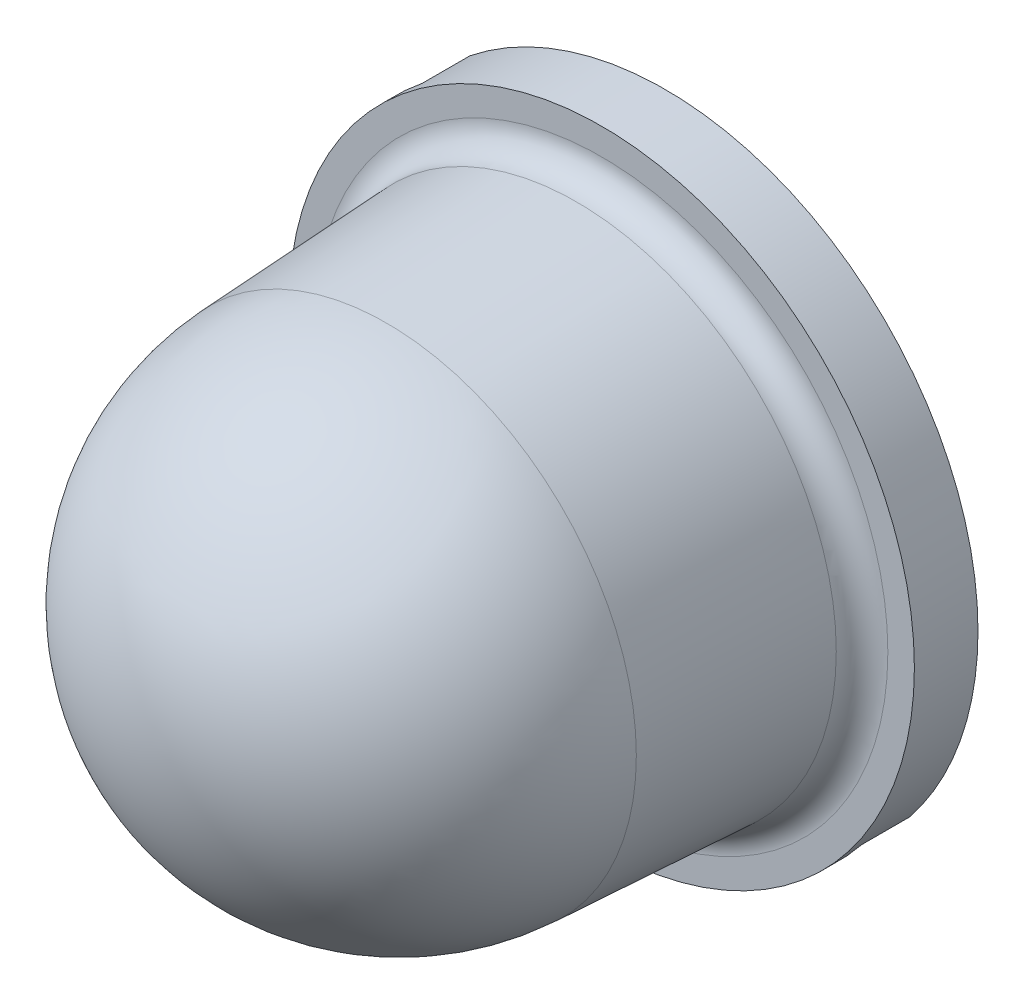
ISO-10303-21;
HEADER;
FILE_DESCRIPTION(('STEP AP214'),'2;1');
FILE_NAME('part.step','',(''),(''),'','','');
FILE_SCHEMA(('AUTOMOTIVE_DESIGN { 1 0 10303 214 1 1 1 1 }'));
ENDSEC;
DATA;
#1=APPLICATION_CONTEXT('core data for automotive mechanical design processes');
#2=APPLICATION_PROTOCOL_DEFINITION('international standard','automotive_design',2000,#1);
#3=PRODUCT_CONTEXT('',#1,'mechanical');
#4=PRODUCT('Part','Part','',(#3));
#5=PRODUCT_RELATED_PRODUCT_CATEGORY('part','',(#4));
#6=PRODUCT_DEFINITION_FORMATION('','',#4);
#7=PRODUCT_DEFINITION_CONTEXT('part definition',#1,'design');
#8=PRODUCT_DEFINITION('design','',#6,#7);
#9=PRODUCT_DEFINITION_SHAPE('','',#8);
#10=(LENGTH_UNIT() NAMED_UNIT(*) SI_UNIT(.MILLI.,.METRE.));
#11=(NAMED_UNIT(*) PLANE_ANGLE_UNIT() SI_UNIT($,.RADIAN.));
#12=(NAMED_UNIT(*) SI_UNIT($,.STERADIAN.) SOLID_ANGLE_UNIT());
#13=UNCERTAINTY_MEASURE_WITH_UNIT(LENGTH_MEASURE(1.E-05),#10,'distance_accuracy_value','');
#14=(GEOMETRIC_REPRESENTATION_CONTEXT(3) GLOBAL_UNCERTAINTY_ASSIGNED_CONTEXT((#13)) GLOBAL_UNIT_ASSIGNED_CONTEXT((#10,
#11,#12)) REPRESENTATION_CONTEXT('',''));
#15=CARTESIAN_POINT('',(0.,0.,0.));
#16=DIRECTION('',(0.,0.,1.));
#17=DIRECTION('',(1.,0.,0.));
#18=AXIS2_PLACEMENT_3D('',#15,#16,#17);
#19=CARTESIAN_POINT('',(0.,0.,9.11138954414596));
#20=DIRECTION('',(0.,0.,1.));
#21=DIRECTION('',(1.,0.,0.));
#22=AXIS2_PLACEMENT_3D('',#19,#20,#21);
#23=CYLINDRICAL_SURFACE('',#22,4.8);
#24=CARTESIAN_POINT('',(0.,0.,0.699999999999999));
#25=DIRECTION('',(0.,0.,1.));
#26=DIRECTION('',(1.,0.,0.));
#27=AXIS2_PLACEMENT_3D('',#24,#25,#26);
#28=CIRCLE('',#27,4.8);
#29=CARTESIAN_POINT('',(-3.8224679027231,2.90322908718063,0.7));
#30=VERTEX_POINT('',#29);
#31=CARTESIAN_POINT('',(2.90322908718058,-3.82246790272313,0.699999999999999));
#32=VERTEX_POINT('',#31);
#33=EDGE_CURVE('E174',#30,#32,#28,.T.);
#34=ORIENTED_EDGE('',*,*,#33,.T.);
#35=DIRECTION('',(0.,0.,-1.));
#36=VECTOR('',#35,1.);
#37=CARTESIAN_POINT('',(2.90322908718058,-3.82246790272313,0.9));
#38=LINE('',#37,#36);
#39=CARTESIAN_POINT('',(2.90322908718058,-3.82246790272313,0.));
#40=VERTEX_POINT('',#39);
#41=EDGE_CURVE('E121',#32,#40,#38,.T.);
#42=ORIENTED_EDGE('',*,*,#41,.T.);
#43=CARTESIAN_POINT('',(0.,0.,0.));
#44=DIRECTION('',(0.,0.,1.));
#45=DIRECTION('',(1.,0.,0.));
#46=AXIS2_PLACEMENT_3D('',#43,#44,#45);
#47=CIRCLE('',#46,4.8);
#48=CARTESIAN_POINT('',(-3.8224679027231,2.90322908718063,0.));
#49=VERTEX_POINT('',#48);
#50=EDGE_CURVE('E198',#49,#40,#47,.T.);
#51=ORIENTED_EDGE('',*,*,#50,.F.);
#52=DIRECTION('',(0.,0.,-1.));
#53=VECTOR('',#52,1.);
#54=CARTESIAN_POINT('',(-3.8224679027231,2.90322908718063,0.9));
#55=LINE('',#54,#53);
#56=EDGE_CURVE('E152',#30,#49,#55,.T.);
#57=ORIENTED_EDGE('',*,*,#56,.F.);
#58=EDGE_LOOP('',(#34,#42,#51,#57));
#59=FACE_BOUND('',#58,.T.);
#60=ADVANCED_FACE('F35',(#59),#23,.F.);
#61=CARTESIAN_POINT('',(-5.9,0.,0.));
#62=DIRECTION('',(0.,0.,1.));
#63=DIRECTION('',(1.,0.,0.));
#64=AXIS2_PLACEMENT_3D('',#61,#62,#63);
#65=PLANE('',#64);
#66=ORIENTED_EDGE('',*,*,#50,.T.);
#67=DIRECTION('',(-0.707106781186543,0.707106781186551,0.));
#68=VECTOR('',#67,1.);
#69=CARTESIAN_POINT('',(3.71231060122935,-4.63154941677191,0.));
#70=LINE('',#69,#68);
#71=CARTESIAN_POINT('',(3.68691529002156,-4.60615410556412,0.));
#72=VERTEX_POINT('',#71);
#73=EDGE_CURVE('E134',#72,#40,#70,.T.);
#74=ORIENTED_EDGE('',*,*,#73,.F.);
#75=CARTESIAN_POINT('',(0.,0.,0.));
#76=DIRECTION('',(0.,0.,1.));
#77=DIRECTION('',(1.,0.,0.));
#78=AXIS2_PLACEMENT_3D('',#75,#76,#77);
#79=CIRCLE('',#78,5.9);
#80=CARTESIAN_POINT('',(-4.60615410556408,3.68691529002162,0.));
#81=VERTEX_POINT('',#80);
#82=EDGE_CURVE('E195',#81,#72,#79,.T.);
#83=ORIENTED_EDGE('',*,*,#82,.F.);
#84=DIRECTION('',(-0.707106781186543,0.707106781186551,0.));
#85=VECTOR('',#84,1.);
#86=CARTESIAN_POINT('',(-4.63154941677187,3.7123106012294,0.));
#87=LINE('',#86,#85);
#88=EDGE_CURVE('E153',#49,#81,#87,.T.);
#89=ORIENTED_EDGE('',*,*,#88,.F.);
#90=EDGE_LOOP('',(#66,#74,#83,#89));
#91=FACE_BOUND('',#90,.T.);
#92=ADVANCED_FACE('F206',(#91),#65,.F.);
#93=CARTESIAN_POINT('',(3.8224679027231,-2.90322908718063,0.));
#94=VERTEX_POINT('',#93);
#95=CARTESIAN_POINT('',(-2.90322908718059,3.82246790272313,0.));
#96=VERTEX_POINT('',#95);
#97=EDGE_CURVE('E196',#94,#96,#47,.T.);
#98=ORIENTED_EDGE('',*,*,#97,.F.);
#99=DIRECTION('',(0.,0.,-1.));
#100=VECTOR('',#99,1.);
#101=CARTESIAN_POINT('',(3.8224679027231,-2.90322908718063,0.9));
#102=LINE('',#101,#100);
#103=CARTESIAN_POINT('',(3.8224679027231,-2.90322908718063,0.7));
#104=VERTEX_POINT('',#103);
#105=EDGE_CURVE('E122',#104,#94,#102,.T.);
#106=ORIENTED_EDGE('',*,*,#105,.F.);
#107=CARTESIAN_POINT('',(-2.90322908718059,3.82246790272313,0.699999999999999));
#108=VERTEX_POINT('',#107);
#109=EDGE_CURVE('E170',#104,#108,#28,.T.);
#110=ORIENTED_EDGE('',*,*,#109,.T.);
#111=DIRECTION('',(0.,0.,-1.));
#112=VECTOR('',#111,1.);
#113=CARTESIAN_POINT('',(-2.90322908718059,3.82246790272313,0.9));
#114=LINE('',#113,#112);
#115=EDGE_CURVE('E157',#108,#96,#114,.T.);
#116=ORIENTED_EDGE('',*,*,#115,.T.);
#117=EDGE_LOOP('',(#98,#106,#110,#116));
#118=FACE_BOUND('',#117,.T.);
#119=ADVANCED_FACE('F37',(#118),#23,.F.);
#120=CARTESIAN_POINT('',(4.60615410556408,-3.68691529002162,0.));
#121=VERTEX_POINT('',#120);
#122=CARTESIAN_POINT('',(-3.68691529002157,4.60615410556412,0.));
#123=VERTEX_POINT('',#122);
#124=EDGE_CURVE('E192',#121,#123,#79,.T.);
#125=ORIENTED_EDGE('',*,*,#124,.F.);
#126=DIRECTION('',(0.707106781186544,-0.707106781186552,0.));
#127=VECTOR('',#126,1.);
#128=CARTESIAN_POINT('',(3.8224679027231,-2.90322908718063,0.));
#129=LINE('',#128,#127);
#130=EDGE_CURVE('E136',#94,#121,#129,.T.);
#131=ORIENTED_EDGE('',*,*,#130,.F.);
#132=ORIENTED_EDGE('',*,*,#97,.T.);
#133=DIRECTION('',(0.707106781186543,-0.707106781186552,0.));
#134=VECTOR('',#133,1.);
#135=CARTESIAN_POINT('',(-2.90322908718059,3.82246790272313,0.));
#136=LINE('',#135,#134);
#137=EDGE_CURVE('E147',#123,#96,#136,.T.);
#138=ORIENTED_EDGE('',*,*,#137,.F.);
#139=EDGE_LOOP('',(#125,#131,#132,#138));
#140=FACE_BOUND('',#139,.T.);
#141=ADVANCED_FACE('F237',(#140),#65,.F.);
#142=CARTESIAN_POINT('',(0.,0.,9.11138954414596));
#143=DIRECTION('',(0.,0.,1.));
#144=DIRECTION('',(1.,0.,0.));
#145=AXIS2_PLACEMENT_3D('',#142,#143,#144);
#146=CYLINDRICAL_SURFACE('',#145,5.9);
#147=ORIENTED_EDGE('',*,*,#82,.T.);
#148=DIRECTION('',(0.,0.,1.));
#149=VECTOR('',#148,1.);
#150=CARTESIAN_POINT('',(3.68691529002156,-4.60615410556412,9.11138954414596));
#151=LINE('',#150,#149);
#152=CARTESIAN_POINT('',(3.68691529002156,-4.60615410556412,0.9));
#153=VERTEX_POINT('',#152);
#154=EDGE_CURVE('E167',#72,#153,#151,.T.);
#155=ORIENTED_EDGE('',*,*,#154,.T.);
#156=CARTESIAN_POINT('',(0.,0.,0.9));
#157=DIRECTION('',(0.,0.,1.));
#158=DIRECTION('',(1.,0.,0.));
#159=AXIS2_PLACEMENT_3D('',#156,#157,#158);
#160=CIRCLE('',#159,5.9);
#161=CARTESIAN_POINT('',(4.60615410556408,-3.68691529002162,0.9));
#162=VERTEX_POINT('',#161);
#163=EDGE_CURVE('E11',#153,#162,#160,.T.);
#164=ORIENTED_EDGE('',*,*,#163,.T.);
#165=DIRECTION('',(0.,0.,1.));
#166=VECTOR('',#165,1.);
#167=CARTESIAN_POINT('',(4.60615410556408,-3.68691529002162,9.11138954414596));
#168=LINE('',#167,#166);
#169=EDGE_CURVE('E128',#162,#121,#168,.F.);
#170=ORIENTED_EDGE('',*,*,#169,.T.);
#171=ORIENTED_EDGE('',*,*,#124,.T.);
#172=DIRECTION('',(0.,0.,1.));
#173=VECTOR('',#172,1.);
#174=CARTESIAN_POINT('',(-3.68691529002157,4.60615410556412,9.11138954414596));
#175=LINE('',#174,#173);
#176=CARTESIAN_POINT('',(-3.68691529002157,4.60615410556412,0.9));
#177=VERTEX_POINT('',#176);
#178=EDGE_CURVE('E163',#123,#177,#175,.T.);
#179=ORIENTED_EDGE('',*,*,#178,.T.);
#180=CARTESIAN_POINT('',(0.,0.,0.9));
#181=DIRECTION('',(0.,0.,1.));
#182=DIRECTION('',(1.,0.,0.));
#183=AXIS2_PLACEMENT_3D('',#180,#181,#182);
#184=CIRCLE('',#183,5.9);
#185=CARTESIAN_POINT('',(-4.60615410556408,3.68691529002162,0.9));
#186=VERTEX_POINT('',#185);
#187=EDGE_CURVE('E43',#177,#186,#184,.T.);
#188=ORIENTED_EDGE('',*,*,#187,.T.);
#189=DIRECTION('',(0.,0.,1.));
#190=VECTOR('',#189,1.);
#191=CARTESIAN_POINT('',(-4.60615410556408,3.68691529002162,9.11138954414596));
#192=LINE('',#191,#190);
#193=EDGE_CURVE('E141',#186,#81,#192,.F.);
#194=ORIENTED_EDGE('',*,*,#193,.T.);
#195=EDGE_LOOP('',(#147,#155,#164,#170,#171,#179,#188,#194));
#196=FACE_BOUND('',#195,.T.);
#197=CARTESIAN_POINT('',(0.,0.,1.2));
#198=DIRECTION('',(0.,0.,1.));
#199=DIRECTION('',(1.,0.,0.));
#200=AXIS2_PLACEMENT_3D('',#197,#198,#199);
#201=CIRCLE('',#200,5.9);
#202=CARTESIAN_POINT('',(5.9,0.,1.2));
#203=VERTEX_POINT('',#202);
#204=EDGE_CURVE('E189',#203,#203,#201,.T.);
#205=ORIENTED_EDGE('',*,*,#204,.F.);
#206=EDGE_LOOP('',(#205));
#207=FACE_BOUND('',#206,.T.);
#208=ADVANCED_FACE('F239',(#196,#207),#146,.T.);
#209=CARTESIAN_POINT('',(-5.9,0.,1.2));
#210=DIRECTION('',(0.,0.,-1.));
#211=DIRECTION('',(-1.,0.,0.));
#212=AXIS2_PLACEMENT_3D('',#209,#210,#211);
#213=PLANE('',#212);
#214=CARTESIAN_POINT('',(0.,0.,1.2));
#215=DIRECTION('',(0.,0.,1.));
#216=DIRECTION('',(1.,0.,0.));
#217=AXIS2_PLACEMENT_3D('',#214,#215,#216);
#218=CIRCLE('',#217,5.39931476737729);
#219=CARTESIAN_POINT('',(5.39931476737729,0.,1.2));
#220=VERTEX_POINT('',#219);
#221=EDGE_CURVE('E186',#220,#220,#218,.T.);
#222=ORIENTED_EDGE('',*,*,#221,.F.);
#223=EDGE_LOOP('',(#222));
#224=FACE_BOUND('',#223,.T.);
#225=ORIENTED_EDGE('',*,*,#204,.T.);
#226=EDGE_LOOP('',(#225));
#227=FACE_BOUND('',#226,.T.);
#228=ADVANCED_FACE('F242',(#224,#227),#213,.F.);
#229=CARTESIAN_POINT('',(0.,0.,1.7));
#230=DIRECTION('',(0.,0.,1.));
#231=DIRECTION('',(1.,0.,0.));
#232=AXIS2_PLACEMENT_3D('',#229,#230,#231);
#233=TOROIDAL_SURFACE('',#232,5.39931476737729,0.5);
#234=CARTESIAN_POINT('',(0.,0.,1.67383202187853));
#235=DIRECTION('',(0.,0.,1.));
#236=DIRECTION('',(1.,0.,0.));
#237=AXIS2_PLACEMENT_3D('',#234,#235,#236);
#238=CIRCLE('',#237,4.9);
#239=CARTESIAN_POINT('',(4.9,0.,1.67383202187853));
#240=VERTEX_POINT('',#239);
#241=EDGE_CURVE('E183',#240,#240,#238,.T.);
#242=ORIENTED_EDGE('',*,*,#241,.F.);
#243=EDGE_LOOP('',(#242));
#244=FACE_BOUND('',#243,.T.);
#245=ORIENTED_EDGE('',*,*,#221,.T.);
#246=EDGE_LOOP('',(#245));
#247=FACE_BOUND('',#246,.T.);
#248=ADVANCED_FACE('F247',(#244,#247),#233,.F.);
#249=CARTESIAN_POINT('',(0.,0.,1.67383202187853));
#250=DIRECTION('',(0.,0.,-1.));
#251=DIRECTION('',(-1.,0.,0.));
#252=AXIS2_PLACEMENT_3D('',#249,#250,#251);
#253=CONICAL_SURFACE('',#252,4.9,0.05235987755983);
#254=CARTESIAN_POINT('',(0.,0.,5.25834253449101));
#255=DIRECTION('',(0.,0.,1.));
#256=DIRECTION('',(1.,0.,0.));
#257=AXIS2_PLACEMENT_3D('',#254,#255,#256);
#258=CIRCLE('',#257,4.71214376421726);
#259=CARTESIAN_POINT('',(4.71214376421726,0.,5.25834253449101));
#260=VERTEX_POINT('',#259);
#261=EDGE_CURVE('E180',#260,#260,#258,.T.);
#262=ORIENTED_EDGE('',*,*,#261,.F.);
#263=EDGE_LOOP('',(#262));
#264=FACE_BOUND('',#263,.T.);
#265=ORIENTED_EDGE('',*,*,#241,.T.);
#266=EDGE_LOOP('',(#265));
#267=FACE_BOUND('',#266,.T.);
#268=ADVANCED_FACE('F253',(#264,#267),#253,.T.);
#269=CARTESIAN_POINT('',(0.,0.,5.01138954414596));
#270=DIRECTION('',(0.,0.,1.));
#271=DIRECTION('',(-1.,0.,0.));
#272=AXIS2_PLACEMENT_3D('',#269,#270,#271);
#273=SPHERICAL_SURFACE('',#272,4.71861045585388);
#274=ORIENTED_EDGE('',*,*,#261,.T.);
#275=EDGE_LOOP('',(#274));
#276=FACE_BOUND('',#275,.T.);
#277=ADVANCED_FACE('F359',(#276),#273,.T.);
#278=CARTESIAN_POINT('',(0.,0.,5.01138954414596));
#279=DIRECTION('',(0.,0.,1.));
#280=DIRECTION('',(-1.,0.,0.));
#281=AXIS2_PLACEMENT_3D('',#278,#279,#280);
#282=SPHERICAL_SURFACE('',#281,4.1);
#283=CARTESIAN_POINT('',(0.,0.,5.01138954414595));
#284=DIRECTION('',(0.,0.,1.));
#285=DIRECTION('',(1.,0.,0.));
#286=AXIS2_PLACEMENT_3D('',#283,#284,#285);
#287=CIRCLE('',#286,4.1);
#288=CARTESIAN_POINT('',(4.1,0.,5.01138954414595));
#289=VERTEX_POINT('',#288);
#290=EDGE_CURVE('E177',#289,#289,#287,.T.);
#291=ORIENTED_EDGE('',*,*,#290,.F.);
#292=EDGE_LOOP('',(#291));
#293=FACE_BOUND('',#292,.T.);
#294=ADVANCED_FACE('F355',(#293),#282,.F.);
#295=CARTESIAN_POINT('',(0.,0.,9.11138954414596));
#296=DIRECTION('',(0.,0.,1.));
#297=DIRECTION('',(1.,0.,0.));
#298=AXIS2_PLACEMENT_3D('',#295,#296,#297);
#299=CYLINDRICAL_SURFACE('',#298,4.1);
#300=CARTESIAN_POINT('',(0.,0.,0.699999999999999));
#301=DIRECTION('',(0.,0.,1.));
#302=DIRECTION('',(1.,0.,0.));
#303=AXIS2_PLACEMENT_3D('',#300,#301,#302);
#304=CIRCLE('',#303,4.1);
#305=CARTESIAN_POINT('',(4.1,0.,0.699999999999999));
#306=VERTEX_POINT('',#305);
#307=EDGE_CURVE('E173',#306,#306,#304,.T.);
#308=ORIENTED_EDGE('',*,*,#307,.F.);
#309=EDGE_LOOP('',(#308));
#310=FACE_BOUND('',#309,.T.);
#311=ORIENTED_EDGE('',*,*,#290,.T.);
#312=EDGE_LOOP('',(#311));
#313=FACE_BOUND('',#312,.T.);
#314=ADVANCED_FACE('F281',(#310,#313),#299,.F.);
#315=CARTESIAN_POINT('',(-4.8,0.,0.7));
#316=DIRECTION('',(0.,0.,1.));
#317=DIRECTION('',(1.,0.,0.));
#318=AXIS2_PLACEMENT_3D('',#315,#316,#317);
#319=PLANE('',#318);
#320=EDGE_CURVE('E171',#108,#30,#28,.T.);
#321=ORIENTED_EDGE('',*,*,#320,.F.);
#322=ORIENTED_EDGE('',*,*,#109,.F.);
#323=EDGE_CURVE('E118',#32,#104,#28,.T.);
#324=ORIENTED_EDGE('',*,*,#323,.F.);
#325=ORIENTED_EDGE('',*,*,#33,.F.);
#326=EDGE_LOOP('',(#321,#322,#324,#325));
#327=FACE_BOUND('',#326,.T.);
#328=ORIENTED_EDGE('',*,*,#307,.T.);
#329=EDGE_LOOP('',(#328));
#330=FACE_BOUND('',#329,.T.);
#331=ADVANCED_FACE('F219',(#327,#330),#319,.F.);
#332=CARTESIAN_POINT('',(0.,0.,0.9));
#333=DIRECTION('',(0.,0.,1.));
#334=DIRECTION('',(1.,0.,0.));
#335=AXIS2_PLACEMENT_3D('',#332,#333,#334);
#336=PLANE('',#335);
#337=DIRECTION('',(0.707106781186543,-0.707106781186552,0.));
#338=VECTOR('',#337,1.);
#339=CARTESIAN_POINT('',(-2.90322908718059,3.82246790272313,0.9));
#340=LINE('',#339,#338);
#341=CARTESIAN_POINT('',(-2.90322908718059,3.82246790272313,0.9));
#342=VERTEX_POINT('',#341);
#343=EDGE_CURVE('E150',#177,#342,#340,.T.);
#344=ORIENTED_EDGE('',*,*,#343,.T.);
#345=CARTESIAN_POINT('',(0.,0.,0.9));
#346=DIRECTION('',(0.,0.,1.));
#347=DIRECTION('',(1.,0.,0.));
#348=AXIS2_PLACEMENT_3D('',#345,#346,#347);
#349=CIRCLE('',#348,4.8);
#350=CARTESIAN_POINT('',(-3.8224679027231,2.90322908718063,0.9));
#351=VERTEX_POINT('',#350);
#352=EDGE_CURVE('E143',#342,#351,#349,.T.);
#353=ORIENTED_EDGE('',*,*,#352,.T.);
#354=DIRECTION('',(-0.707106781186543,0.707106781186551,0.));
#355=VECTOR('',#354,1.);
#356=CARTESIAN_POINT('',(-4.63154941677187,3.7123106012294,0.9));
#357=LINE('',#356,#355);
#358=EDGE_CURVE('E146',#351,#186,#357,.T.);
#359=ORIENTED_EDGE('',*,*,#358,.T.);
#360=ORIENTED_EDGE('',*,*,#187,.F.);
#361=EDGE_LOOP('',(#344,#353,#359,#360));
#362=FACE_BOUND('',#361,.T.);
#363=ADVANCED_FACE('F230',(#362),#336,.F.);
#364=CARTESIAN_POINT('',(0.,0.,0.9));
#365=DIRECTION('',(0.,0.,-1.));
#366=DIRECTION('',(-1.,0.,0.));
#367=AXIS2_PLACEMENT_3D('',#364,#365,#366);
#368=CYLINDRICAL_SURFACE('',#367,4.8);
#369=EDGE_CURVE('E158',#351,#30,#55,.T.);
#370=ORIENTED_EDGE('',*,*,#369,.F.);
#371=ORIENTED_EDGE('',*,*,#352,.F.);
#372=EDGE_CURVE('E58',#342,#108,#114,.T.);
#373=ORIENTED_EDGE('',*,*,#372,.T.);
#374=ORIENTED_EDGE('',*,*,#320,.T.);
#375=EDGE_LOOP('',(#370,#371,#373,#374));
#376=FACE_BOUND('',#375,.T.);
#377=ADVANCED_FACE('F225',(#376),#368,.T.);
#378=CARTESIAN_POINT('',(-2.90322908718059,3.82246790272313,0.9));
#379=DIRECTION('',(0.707106781186552,0.707106781186543,0.));
#380=DIRECTION('',(-0.707106781186543,0.707106781186552,0.));
#381=AXIS2_PLACEMENT_3D('',#378,#379,#380);
#382=PLANE('',#381);
#383=ORIENTED_EDGE('',*,*,#137,.T.);
#384=ORIENTED_EDGE('',*,*,#115,.F.);
#385=ORIENTED_EDGE('',*,*,#372,.F.);
#386=ORIENTED_EDGE('',*,*,#343,.F.);
#387=ORIENTED_EDGE('',*,*,#178,.F.);
#388=EDGE_LOOP('',(#383,#384,#385,#386,#387));
#389=FACE_BOUND('',#388,.T.);
#390=ADVANCED_FACE('F233',(#389),#382,.F.);
#391=CARTESIAN_POINT('',(-4.63154941677187,3.7123106012294,0.9));
#392=DIRECTION('',(-0.707106781186551,-0.707106781186544,0.));
#393=DIRECTION('',(0.707106781186544,-0.707106781186551,0.));
#394=AXIS2_PLACEMENT_3D('',#391,#392,#393);
#395=PLANE('',#394);
#396=ORIENTED_EDGE('',*,*,#358,.F.);
#397=ORIENTED_EDGE('',*,*,#369,.T.);
#398=ORIENTED_EDGE('',*,*,#56,.T.);
#399=ORIENTED_EDGE('',*,*,#88,.T.);
#400=ORIENTED_EDGE('',*,*,#193,.F.);
#401=EDGE_LOOP('',(#396,#397,#398,#399,#400));
#402=FACE_BOUND('',#401,.T.);
#403=ADVANCED_FACE('F228',(#402),#395,.F.);
#404=CARTESIAN_POINT('',(0.,0.,0.9));
#405=DIRECTION('',(0.,0.,1.));
#406=DIRECTION('',(1.,0.,0.));
#407=AXIS2_PLACEMENT_3D('',#404,#405,#406);
#408=PLANE('',#407);
#409=DIRECTION('',(-0.707106781186543,0.707106781186551,0.));
#410=VECTOR('',#409,1.);
#411=CARTESIAN_POINT('',(3.71231060122935,-4.63154941677191,0.9));
#412=LINE('',#411,#410);
#413=CARTESIAN_POINT('',(2.90322908718058,-3.82246790272313,0.9));
#414=VERTEX_POINT('',#413);
#415=EDGE_CURVE('E130',#153,#414,#412,.T.);
#416=ORIENTED_EDGE('',*,*,#415,.T.);
#417=CARTESIAN_POINT('',(0.,0.,0.9));
#418=DIRECTION('',(0.,0.,1.));
#419=DIRECTION('',(1.,0.,0.));
#420=AXIS2_PLACEMENT_3D('',#417,#418,#419);
#421=CIRCLE('',#420,4.8);
#422=CARTESIAN_POINT('',(3.8224679027231,-2.90322908718063,0.9));
#423=VERTEX_POINT('',#422);
#424=EDGE_CURVE('E116',#414,#423,#421,.T.);
#425=ORIENTED_EDGE('',*,*,#424,.T.);
#426=DIRECTION('',(0.707106781186544,-0.707106781186552,0.));
#427=VECTOR('',#426,1.);
#428=CARTESIAN_POINT('',(3.8224679027231,-2.90322908718063,0.9));
#429=LINE('',#428,#427);
#430=EDGE_CURVE('E125',#423,#162,#429,.T.);
#431=ORIENTED_EDGE('',*,*,#430,.T.);
#432=ORIENTED_EDGE('',*,*,#163,.F.);
#433=EDGE_LOOP('',(#416,#425,#431,#432));
#434=FACE_BOUND('',#433,.T.);
#435=ADVANCED_FACE('F132',(#434),#408,.F.);
#436=CARTESIAN_POINT('',(0.,0.,0.9));
#437=DIRECTION('',(0.,0.,-1.));
#438=DIRECTION('',(-1.,0.,0.));
#439=AXIS2_PLACEMENT_3D('',#436,#437,#438);
#440=CYLINDRICAL_SURFACE('',#439,4.8);
#441=EDGE_CURVE('E112',#423,#104,#102,.T.);
#442=ORIENTED_EDGE('',*,*,#441,.F.);
#443=ORIENTED_EDGE('',*,*,#424,.F.);
#444=EDGE_CURVE('E50',#414,#32,#38,.T.);
#445=ORIENTED_EDGE('',*,*,#444,.T.);
#446=ORIENTED_EDGE('',*,*,#323,.T.);
#447=EDGE_LOOP('',(#442,#443,#445,#446));
#448=FACE_BOUND('',#447,.T.);
#449=ADVANCED_FACE('F114',(#448),#440,.T.);
#450=CARTESIAN_POINT('',(3.71231060122935,-4.63154941677191,0.9));
#451=DIRECTION('',(-0.707106781186551,-0.707106781186544,0.));
#452=DIRECTION('',(0.707106781186544,-0.707106781186551,0.));
#453=AXIS2_PLACEMENT_3D('',#450,#451,#452);
#454=PLANE('',#453);
#455=ORIENTED_EDGE('',*,*,#73,.T.);
#456=ORIENTED_EDGE('',*,*,#41,.F.);
#457=ORIENTED_EDGE('',*,*,#444,.F.);
#458=ORIENTED_EDGE('',*,*,#415,.F.);
#459=ORIENTED_EDGE('',*,*,#154,.F.);
#460=EDGE_LOOP('',(#455,#456,#457,#458,#459));
#461=FACE_BOUND('',#460,.T.);
#462=ADVANCED_FACE('F215',(#461),#454,.F.);
#463=CARTESIAN_POINT('',(3.8224679027231,-2.90322908718063,0.9));
#464=DIRECTION('',(0.707106781186551,0.707106781186544,0.));
#465=DIRECTION('',(-0.707106781186544,0.707106781186551,0.));
#466=AXIS2_PLACEMENT_3D('',#463,#464,#465);
#467=PLANE('',#466);
#468=ORIENTED_EDGE('',*,*,#430,.F.);
#469=ORIENTED_EDGE('',*,*,#441,.T.);
#470=ORIENTED_EDGE('',*,*,#105,.T.);
#471=ORIENTED_EDGE('',*,*,#130,.T.);
#472=ORIENTED_EDGE('',*,*,#169,.F.);
#473=EDGE_LOOP('',(#468,#469,#470,#471,#472));
#474=FACE_BOUND('',#473,.T.);
#475=ADVANCED_FACE('F126',(#474),#467,.F.);
#476=CLOSED_SHELL('',(#60,#92,#119,#141,#208,#228,#248,#268,#277,#294,#314,#331,#363,#377,#390,
#403,#435,#449,#462,#475));
#477=MANIFOLD_SOLID_BREP('B2',#476);
#478=ADVANCED_BREP_SHAPE_REPRESENTATION('',(#18,#477),#14);
#479=SHAPE_DEFINITION_REPRESENTATION(#9,#478);
ENDSEC;
END-ISO-10303-21;
